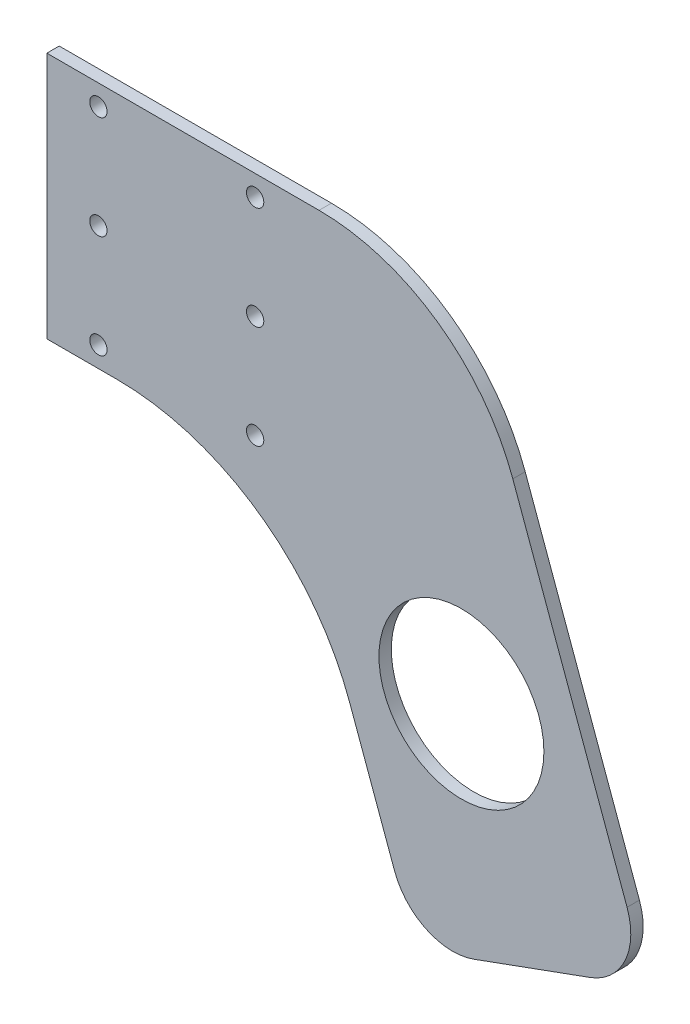
ISO-10303-21;
HEADER;
FILE_DESCRIPTION(('STEP AP214'),'2;1');
FILE_NAME('part.step','',(''),(''),'','','');
FILE_SCHEMA(('AUTOMOTIVE_DESIGN { 1 0 10303 214 1 1 1 1 }'));
ENDSEC;
DATA;
#1=APPLICATION_CONTEXT('core data for automotive mechanical design processes');
#2=APPLICATION_PROTOCOL_DEFINITION('international standard','automotive_design',2000,#1);
#3=PRODUCT_CONTEXT('',#1,'mechanical');
#4=PRODUCT('Part','Part','',(#3));
#5=PRODUCT_RELATED_PRODUCT_CATEGORY('part','',(#4));
#6=PRODUCT_DEFINITION_FORMATION('','',#4);
#7=PRODUCT_DEFINITION_CONTEXT('part definition',#1,'design');
#8=PRODUCT_DEFINITION('design','',#6,#7);
#9=PRODUCT_DEFINITION_SHAPE('','',#8);
#10=(LENGTH_UNIT() NAMED_UNIT(*) SI_UNIT(.MILLI.,.METRE.));
#11=(NAMED_UNIT(*) PLANE_ANGLE_UNIT() SI_UNIT($,.RADIAN.));
#12=(NAMED_UNIT(*) SI_UNIT($,.STERADIAN.) SOLID_ANGLE_UNIT());
#13=UNCERTAINTY_MEASURE_WITH_UNIT(LENGTH_MEASURE(1.E-05),#10,'distance_accuracy_value','');
#14=(GEOMETRIC_REPRESENTATION_CONTEXT(3) GLOBAL_UNCERTAINTY_ASSIGNED_CONTEXT((#13)) GLOBAL_UNIT_ASSIGNED_CONTEXT((#10,
#11,#12)) REPRESENTATION_CONTEXT('',''));
#15=CARTESIAN_POINT('',(0.,0.,0.));
#16=DIRECTION('',(0.,0.,1.));
#17=DIRECTION('',(1.,0.,0.));
#18=AXIS2_PLACEMENT_3D('',#15,#16,#17);
#19=CARTESIAN_POINT('',(0.,0.,3.));
#20=DIRECTION('',(0.,0.,1.));
#21=DIRECTION('',(1.,0.,0.));
#22=AXIS2_PLACEMENT_3D('',#19,#20,#21);
#23=PLANE('',#22);
#24=CARTESIAN_POINT('',(-29.5,56.5646236357601,3.));
#25=DIRECTION('',(0.,0.,1.));
#26=DIRECTION('',(1.,0.,0.));
#27=AXIS2_PLACEMENT_3D('',#24,#25,#26);
#28=CIRCLE('',#27,2.1);
#29=CARTESIAN_POINT('',(-27.4,56.5646236357601,3.));
#30=VERTEX_POINT('',#29);
#31=EDGE_CURVE('E255',#30,#30,#28,.T.);
#32=ORIENTED_EDGE('',*,*,#31,.F.);
#33=EDGE_LOOP('',(#32));
#34=FACE_BOUND('',#33,.T.);
#35=CARTESIAN_POINT('',(-67.5,31.5646236357601,3.));
#36=DIRECTION('',(0.,0.,1.));
#37=DIRECTION('',(1.,0.,0.));
#38=AXIS2_PLACEMENT_3D('',#35,#36,#37);
#39=CIRCLE('',#38,2.1);
#40=CARTESIAN_POINT('',(-65.4,31.5646236357601,3.));
#41=VERTEX_POINT('',#40);
#42=EDGE_CURVE('E243',#41,#41,#39,.T.);
#43=ORIENTED_EDGE('',*,*,#42,.F.);
#44=EDGE_LOOP('',(#43));
#45=FACE_BOUND('',#44,.T.);
#46=CARTESIAN_POINT('',(-67.5,81.5646236357601,3.));
#47=DIRECTION('',(0.,0.,1.));
#48=DIRECTION('',(1.,0.,0.));
#49=AXIS2_PLACEMENT_3D('',#46,#47,#48);
#50=CIRCLE('',#49,2.1);
#51=CARTESIAN_POINT('',(-65.4,81.5646236357601,3.));
#52=VERTEX_POINT('',#51);
#53=EDGE_CURVE('E231',#52,#52,#50,.T.);
#54=ORIENTED_EDGE('',*,*,#53,.F.);
#55=EDGE_LOOP('',(#54));
#56=FACE_BOUND('',#55,.T.);
#57=DIRECTION('',(0.939692620785907,0.342020143325674,0.));
#58=VECTOR('',#57,1.);
#59=CARTESIAN_POINT('',(9.4314371422469,-57.0621689504598,3.));
#60=LINE('',#59,#58);
#61=CARTESIAN_POINT('',(23.5268264540355,-51.9318668005747,3.));
#62=VERTEX_POINT('',#61);
#63=CARTESIAN_POINT('',(51.7176050776127,-41.6712625008045,3.));
#64=VERTEX_POINT('',#63);
#65=EDGE_CURVE('E197',#62,#64,#60,.T.);
#66=ORIENTED_EDGE('',*,*,#65,.T.);
#67=CARTESIAN_POINT('',(46.5873029277276,-27.5758731890159,3.));
#68=DIRECTION('',(0.,0.,1.));
#69=DIRECTION('',(1.,0.,0.));
#70=AXIS2_PLACEMENT_3D('',#67,#68,#69);
#71=CIRCLE('',#70,15.);
#72=CARTESIAN_POINT('',(60.6826922395162,-22.4455710391308,3.));
#73=VERTEX_POINT('',#72);
#74=EDGE_CURVE('E51',#64,#73,#71,.T.);
#75=ORIENTED_EDGE('',*,*,#74,.T.);
#76=DIRECTION('',(-0.342020143325674,0.939692620785907,0.));
#77=VECTOR('',#76,1.);
#78=CARTESIAN_POINT('',(21.0062261462912,86.5646236357601,3.));
#79=LINE('',#78,#77);
#80=CARTESIAN_POINT('',(32.9804802751012,53.6656308020438,3.));
#81=VERTEX_POINT('',#80);
#82=EDGE_CURVE('E133',#73,#81,#79,.T.);
#83=ORIENTED_EDGE('',*,*,#82,.T.);
#84=CARTESIAN_POINT('',(-14.0041507641941,36.5646236357601,3.));
#85=DIRECTION('',(0.,0.,1.));
#86=DIRECTION('',(1.,0.,0.));
#87=AXIS2_PLACEMENT_3D('',#84,#85,#86);
#88=CIRCLE('',#87,50.);
#89=CARTESIAN_POINT('',(-14.0041507641941,86.5646236357601,3.));
#90=VERTEX_POINT('',#89);
#91=EDGE_CURVE('E129',#81,#90,#88,.T.);
#92=ORIENTED_EDGE('',*,*,#91,.T.);
#93=DIRECTION('',(-1.,0.,0.));
#94=VECTOR('',#93,1.);
#95=CARTESIAN_POINT('',(0.,86.5646236357601,3.));
#96=LINE('',#95,#94);
#97=CARTESIAN_POINT('',(-80.,86.5646236357601,3.));
#98=VERTEX_POINT('',#97);
#99=EDGE_CURVE('E121',#90,#98,#96,.T.);
#100=ORIENTED_EDGE('',*,*,#99,.T.);
#101=DIRECTION('',(0.,-1.,0.));
#102=VECTOR('',#101,1.);
#103=CARTESIAN_POINT('',(-80.,26.5646236357601,3.));
#104=LINE('',#103,#102);
#105=CARTESIAN_POINT('',(-80.,26.5646236357601,3.));
#106=VERTEX_POINT('',#105);
#107=EDGE_CURVE('E126',#98,#106,#104,.T.);
#108=ORIENTED_EDGE('',*,*,#107,.T.);
#109=DIRECTION('',(1.,0.,0.));
#110=VECTOR('',#109,1.);
#111=CARTESIAN_POINT('',(-80.,26.5646236357601,3.));
#112=LINE('',#111,#110);
#113=CARTESIAN_POINT('',(-63.0186784388735,26.5646236357601,3.));
#114=VERTEX_POINT('',#113);
#115=EDGE_CURVE('E164',#106,#114,#112,.T.);
#116=ORIENTED_EDGE('',*,*,#115,.T.);
#117=CARTESIAN_POINT('',(-63.0186784388735,-33.4353763642399,3.));
#118=DIRECTION('',(0.,0.,1.));
#119=DIRECTION('',(1.,0.,0.));
#120=AXIS2_PLACEMENT_3D('',#117,#118,#119);
#121=CIRCLE('',#120,60.);
#122=CARTESIAN_POINT('',(-6.63712119171913,-12.9141677646995,3.));
#123=VERTEX_POINT('',#122);
#124=EDGE_CURVE('E181',#114,#123,#121,.F.);
#125=ORIENTED_EDGE('',*,*,#124,.T.);
#126=DIRECTION('',(0.342020143325674,-0.939692620785907,0.));
#127=VECTOR('',#126,1.);
#128=CARTESIAN_POINT('',(-21.0062261462912,26.5646236357601,3.));
#129=LINE('',#128,#127);
#130=CARTESIAN_POINT('',(4.3011349923618,-42.9667796386713,3.));
#131=VERTEX_POINT('',#130);
#132=EDGE_CURVE('E216',#123,#131,#129,.T.);
#133=ORIENTED_EDGE('',*,*,#132,.T.);
#134=CARTESIAN_POINT('',(18.3965243041504,-37.8364774887862,3.));
#135=DIRECTION('',(0.,0.,1.));
#136=DIRECTION('',(1.,0.,0.));
#137=AXIS2_PLACEMENT_3D('',#134,#135,#136);
#138=CIRCLE('',#137,15.);
#139=EDGE_CURVE('E194',#131,#62,#138,.T.);
#140=ORIENTED_EDGE('',*,*,#139,.T.);
#141=EDGE_LOOP('',(#66,#75,#83,#92,#100,#108,#116,#125,#133,#140));
#142=FACE_BOUND('',#141,.T.);
#143=CARTESIAN_POINT('',(20.5212085995404,0.183066388605708,3.));
#144=DIRECTION('',(0.,0.,1.));
#145=DIRECTION('',(1.,0.,0.));
#146=AXIS2_PLACEMENT_3D('',#143,#144,#145);
#147=CIRCLE('',#146,20.);
#148=CARTESIAN_POINT('',(40.5212085995404,0.183066388605708,3.));
#149=VERTEX_POINT('',#148);
#150=EDGE_CURVE('E156',#149,#149,#147,.T.);
#151=ORIENTED_EDGE('',*,*,#150,.F.);
#152=EDGE_LOOP('',(#151));
#153=FACE_BOUND('',#152,.T.);
#154=CARTESIAN_POINT('',(-67.5,56.5646236357601,3.));
#155=DIRECTION('',(0.,0.,1.));
#156=DIRECTION('',(1.,0.,0.));
#157=AXIS2_PLACEMENT_3D('',#154,#155,#156);
#158=CIRCLE('',#157,2.1);
#159=CARTESIAN_POINT('',(-65.4,56.5646236357601,3.));
#160=VERTEX_POINT('',#159);
#161=EDGE_CURVE('E237',#160,#160,#158,.T.);
#162=ORIENTED_EDGE('',*,*,#161,.F.);
#163=EDGE_LOOP('',(#162));
#164=FACE_BOUND('',#163,.T.);
#165=CARTESIAN_POINT('',(-29.5,81.5646236357601,3.));
#166=DIRECTION('',(0.,0.,1.));
#167=DIRECTION('',(1.,0.,0.));
#168=AXIS2_PLACEMENT_3D('',#165,#166,#167);
#169=CIRCLE('',#168,2.1);
#170=CARTESIAN_POINT('',(-27.4,81.5646236357601,3.));
#171=VERTEX_POINT('',#170);
#172=EDGE_CURVE('E249',#171,#171,#169,.T.);
#173=ORIENTED_EDGE('',*,*,#172,.F.);
#174=EDGE_LOOP('',(#173));
#175=FACE_BOUND('',#174,.T.);
#176=CARTESIAN_POINT('',(-29.5,31.5646236357601,3.));
#177=DIRECTION('',(0.,0.,1.));
#178=DIRECTION('',(1.,0.,0.));
#179=AXIS2_PLACEMENT_3D('',#176,#177,#178);
#180=CIRCLE('',#179,2.1);
#181=CARTESIAN_POINT('',(-27.4,31.5646236357601,3.));
#182=VERTEX_POINT('',#181);
#183=EDGE_CURVE('E261',#182,#182,#180,.T.);
#184=ORIENTED_EDGE('',*,*,#183,.F.);
#185=EDGE_LOOP('',(#184));
#186=FACE_BOUND('',#185,.T.);
#187=ADVANCED_FACE('F43',(#34,#45,#56,#142,#153,#164,#175,#186),#23,.T.);
#188=CARTESIAN_POINT('',(0.,0.,0.));
#189=DIRECTION('',(0.,0.,1.));
#190=DIRECTION('',(1.,0.,0.));
#191=AXIS2_PLACEMENT_3D('',#188,#189,#190);
#192=PLANE('',#191);
#193=DIRECTION('',(-0.342020143325674,0.939692620785907,0.));
#194=VECTOR('',#193,1.);
#195=CARTESIAN_POINT('',(21.0062261462912,86.5646236357601,0.));
#196=LINE('',#195,#194);
#197=CARTESIAN_POINT('',(60.6826922395162,-22.4455710391308,0.));
#198=VERTEX_POINT('',#197);
#199=CARTESIAN_POINT('',(32.9804802751012,53.6656308020438,0.));
#200=VERTEX_POINT('',#199);
#201=EDGE_CURVE('E160',#198,#200,#196,.T.);
#202=ORIENTED_EDGE('',*,*,#201,.F.);
#203=CARTESIAN_POINT('',(46.5873029277276,-27.5758731890159,0.));
#204=DIRECTION('',(0.,0.,1.));
#205=DIRECTION('',(1.,0.,0.));
#206=AXIS2_PLACEMENT_3D('',#203,#204,#205);
#207=CIRCLE('',#206,15.);
#208=CARTESIAN_POINT('',(51.7176050776127,-41.6712625008045,0.));
#209=VERTEX_POINT('',#208);
#210=EDGE_CURVE('E188',#198,#209,#207,.F.);
#211=ORIENTED_EDGE('',*,*,#210,.T.);
#212=DIRECTION('',(0.939692620785907,0.342020143325674,0.));
#213=VECTOR('',#212,1.);
#214=CARTESIAN_POINT('',(9.4314371422469,-57.0621689504598,0.));
#215=LINE('',#214,#213);
#216=CARTESIAN_POINT('',(23.5268264540355,-51.9318668005747,0.));
#217=VERTEX_POINT('',#216);
#218=EDGE_CURVE('E158',#217,#209,#215,.T.);
#219=ORIENTED_EDGE('',*,*,#218,.F.);
#220=CARTESIAN_POINT('',(18.3965243041504,-37.8364774887862,0.));
#221=DIRECTION('',(0.,0.,1.));
#222=DIRECTION('',(1.,0.,0.));
#223=AXIS2_PLACEMENT_3D('',#220,#221,#222);
#224=CIRCLE('',#223,15.);
#225=CARTESIAN_POINT('',(4.3011349923618,-42.9667796386713,0.));
#226=VERTEX_POINT('',#225);
#227=EDGE_CURVE('E186',#217,#226,#224,.F.);
#228=ORIENTED_EDGE('',*,*,#227,.T.);
#229=DIRECTION('',(0.342020143325674,-0.939692620785907,0.));
#230=VECTOR('',#229,1.);
#231=CARTESIAN_POINT('',(-21.0062261462912,26.5646236357601,0.));
#232=LINE('',#231,#230);
#233=CARTESIAN_POINT('',(-6.63712119171913,-12.9141677646995,0.));
#234=VERTEX_POINT('',#233);
#235=EDGE_CURVE('E155',#234,#226,#232,.T.);
#236=ORIENTED_EDGE('',*,*,#235,.F.);
#237=CARTESIAN_POINT('',(-63.0186784388735,-33.4353763642399,0.));
#238=DIRECTION('',(0.,0.,1.));
#239=DIRECTION('',(1.,0.,0.));
#240=AXIS2_PLACEMENT_3D('',#237,#238,#239);
#241=CIRCLE('',#240,60.);
#242=CARTESIAN_POINT('',(-63.0186784388735,26.5646236357601,0.));
#243=VERTEX_POINT('',#242);
#244=EDGE_CURVE('E179',#234,#243,#241,.T.);
#245=ORIENTED_EDGE('',*,*,#244,.T.);
#246=DIRECTION('',(1.,0.,0.));
#247=VECTOR('',#246,1.);
#248=CARTESIAN_POINT('',(-80.,26.5646236357601,0.));
#249=LINE('',#248,#247);
#250=CARTESIAN_POINT('',(-80.,26.5646236357601,0.));
#251=VERTEX_POINT('',#250);
#252=EDGE_CURVE('E152',#251,#243,#249,.T.);
#253=ORIENTED_EDGE('',*,*,#252,.F.);
#254=DIRECTION('',(0.,-1.,0.));
#255=VECTOR('',#254,1.);
#256=CARTESIAN_POINT('',(-80.,26.5646236357601,0.));
#257=LINE('',#256,#255);
#258=CARTESIAN_POINT('',(-80.,86.5646236357601,0.));
#259=VERTEX_POINT('',#258);
#260=EDGE_CURVE('E163',#259,#251,#257,.T.);
#261=ORIENTED_EDGE('',*,*,#260,.F.);
#262=DIRECTION('',(-1.,0.,0.));
#263=VECTOR('',#262,1.);
#264=CARTESIAN_POINT('',(-80.,86.5646236357601,0.));
#265=LINE('',#264,#263);
#266=CARTESIAN_POINT('',(-14.0041507641941,86.5646236357601,0.));
#267=VERTEX_POINT('',#266);
#268=EDGE_CURVE('E139',#267,#259,#265,.T.);
#269=ORIENTED_EDGE('',*,*,#268,.F.);
#270=CARTESIAN_POINT('',(-14.0041507641941,36.5646236357601,0.));
#271=DIRECTION('',(0.,0.,1.));
#272=DIRECTION('',(1.,0.,0.));
#273=AXIS2_PLACEMENT_3D('',#270,#271,#272);
#274=CIRCLE('',#273,50.);
#275=EDGE_CURVE('E167',#267,#200,#274,.F.);
#276=ORIENTED_EDGE('',*,*,#275,.T.);
#277=EDGE_LOOP('',(#202,#211,#219,#228,#236,#245,#253,#261,#269,#276));
#278=FACE_BOUND('',#277,.T.);
#279=CARTESIAN_POINT('',(20.5212085995404,0.183066388605708,0.));
#280=DIRECTION('',(0.,0.,1.));
#281=DIRECTION('',(1.,0.,0.));
#282=AXIS2_PLACEMENT_3D('',#279,#280,#281);
#283=CIRCLE('',#282,20.);
#284=CARTESIAN_POINT('',(40.5212085995404,0.183066388605708,0.));
#285=VERTEX_POINT('',#284);
#286=EDGE_CURVE('E227',#285,#285,#283,.T.);
#287=ORIENTED_EDGE('',*,*,#286,.T.);
#288=EDGE_LOOP('',(#287));
#289=FACE_BOUND('',#288,.T.);
#290=CARTESIAN_POINT('',(-67.5,81.5646236357601,0.));
#291=DIRECTION('',(0.,0.,1.));
#292=DIRECTION('',(1.,0.,0.));
#293=AXIS2_PLACEMENT_3D('',#290,#291,#292);
#294=CIRCLE('',#293,2.1);
#295=CARTESIAN_POINT('',(-65.4,81.5646236357601,0.));
#296=VERTEX_POINT('',#295);
#297=EDGE_CURVE('E234',#296,#296,#294,.T.);
#298=ORIENTED_EDGE('',*,*,#297,.T.);
#299=EDGE_LOOP('',(#298));
#300=FACE_BOUND('',#299,.T.);
#301=CARTESIAN_POINT('',(-67.5,56.5646236357601,0.));
#302=DIRECTION('',(0.,0.,1.));
#303=DIRECTION('',(1.,0.,0.));
#304=AXIS2_PLACEMENT_3D('',#301,#302,#303);
#305=CIRCLE('',#304,2.1);
#306=CARTESIAN_POINT('',(-65.4,56.5646236357601,0.));
#307=VERTEX_POINT('',#306);
#308=EDGE_CURVE('E240',#307,#307,#305,.T.);
#309=ORIENTED_EDGE('',*,*,#308,.T.);
#310=EDGE_LOOP('',(#309));
#311=FACE_BOUND('',#310,.T.);
#312=CARTESIAN_POINT('',(-67.5,31.5646236357601,0.));
#313=DIRECTION('',(0.,0.,1.));
#314=DIRECTION('',(1.,0.,0.));
#315=AXIS2_PLACEMENT_3D('',#312,#313,#314);
#316=CIRCLE('',#315,2.1);
#317=CARTESIAN_POINT('',(-65.4,31.5646236357601,0.));
#318=VERTEX_POINT('',#317);
#319=EDGE_CURVE('E246',#318,#318,#316,.T.);
#320=ORIENTED_EDGE('',*,*,#319,.T.);
#321=EDGE_LOOP('',(#320));
#322=FACE_BOUND('',#321,.T.);
#323=CARTESIAN_POINT('',(-29.5,81.5646236357601,0.));
#324=DIRECTION('',(0.,0.,1.));
#325=DIRECTION('',(1.,0.,0.));
#326=AXIS2_PLACEMENT_3D('',#323,#324,#325);
#327=CIRCLE('',#326,2.1);
#328=CARTESIAN_POINT('',(-27.4,81.5646236357601,0.));
#329=VERTEX_POINT('',#328);
#330=EDGE_CURVE('E252',#329,#329,#327,.T.);
#331=ORIENTED_EDGE('',*,*,#330,.T.);
#332=EDGE_LOOP('',(#331));
#333=FACE_BOUND('',#332,.T.);
#334=CARTESIAN_POINT('',(-29.5,56.5646236357601,0.));
#335=DIRECTION('',(0.,0.,1.));
#336=DIRECTION('',(1.,0.,0.));
#337=AXIS2_PLACEMENT_3D('',#334,#335,#336);
#338=CIRCLE('',#337,2.1);
#339=CARTESIAN_POINT('',(-27.4,56.5646236357601,0.));
#340=VERTEX_POINT('',#339);
#341=EDGE_CURVE('E258',#340,#340,#338,.T.);
#342=ORIENTED_EDGE('',*,*,#341,.T.);
#343=EDGE_LOOP('',(#342));
#344=FACE_BOUND('',#343,.T.);
#345=CARTESIAN_POINT('',(-29.5,31.5646236357601,0.));
#346=DIRECTION('',(0.,0.,1.));
#347=DIRECTION('',(1.,0.,0.));
#348=AXIS2_PLACEMENT_3D('',#345,#346,#347);
#349=CIRCLE('',#348,2.1);
#350=CARTESIAN_POINT('',(-27.4,31.5646236357601,0.));
#351=VERTEX_POINT('',#350);
#352=EDGE_CURVE('E264',#351,#351,#349,.T.);
#353=ORIENTED_EDGE('',*,*,#352,.T.);
#354=EDGE_LOOP('',(#353));
#355=FACE_BOUND('',#354,.T.);
#356=ADVANCED_FACE('F207',(#278,#289,#300,#311,#322,#333,#344,#355),#192,.F.);
#357=CARTESIAN_POINT('',(-80.,26.5646236357601,3.));
#358=DIRECTION('',(0.,1.,0.));
#359=DIRECTION('',(-1.,0.,0.));
#360=AXIS2_PLACEMENT_3D('',#357,#358,#359);
#361=PLANE('',#360);
#362=ORIENTED_EDGE('',*,*,#252,.T.);
#363=DIRECTION('',(0.,0.,-1.));
#364=VECTOR('',#363,1.);
#365=CARTESIAN_POINT('',(-63.0186784388735,26.5646236357601,3.));
#366=LINE('',#365,#364);
#367=EDGE_CURVE('E177',#243,#114,#366,.F.);
#368=ORIENTED_EDGE('',*,*,#367,.T.);
#369=ORIENTED_EDGE('',*,*,#115,.F.);
#370=DIRECTION('',(0.,0.,-1.));
#371=VECTOR('',#370,1.);
#372=CARTESIAN_POINT('',(-80.,26.5646236357601,3.));
#373=LINE('',#372,#371);
#374=EDGE_CURVE('E143',#106,#251,#373,.T.);
#375=ORIENTED_EDGE('',*,*,#374,.T.);
#376=EDGE_LOOP('',(#362,#368,#369,#375));
#377=FACE_BOUND('',#376,.T.);
#378=ADVANCED_FACE('F223',(#377),#361,.F.);
#379=CARTESIAN_POINT('',(-21.0062261462912,26.5646236357601,3.));
#380=DIRECTION('',(0.939692620785906,0.342020143325673,0.));
#381=DIRECTION('',(-0.342020143325674,0.939692620785907,0.));
#382=AXIS2_PLACEMENT_3D('',#379,#380,#381);
#383=PLANE('',#382);
#384=ORIENTED_EDGE('',*,*,#235,.T.);
#385=DIRECTION('',(0.,0.,-1.));
#386=VECTOR('',#385,1.);
#387=CARTESIAN_POINT('',(4.3011349923618,-42.9667796386713,3.));
#388=LINE('',#387,#386);
#389=EDGE_CURVE('E11',#226,#131,#388,.F.);
#390=ORIENTED_EDGE('',*,*,#389,.T.);
#391=ORIENTED_EDGE('',*,*,#132,.F.);
#392=DIRECTION('',(0.,0.,-1.));
#393=VECTOR('',#392,1.);
#394=CARTESIAN_POINT('',(-6.63712119171913,-12.9141677646995,0.));
#395=LINE('',#394,#393);
#396=EDGE_CURVE('E174',#123,#234,#395,.T.);
#397=ORIENTED_EDGE('',*,*,#396,.T.);
#398=EDGE_LOOP('',(#384,#390,#391,#397));
#399=FACE_BOUND('',#398,.T.);
#400=ADVANCED_FACE('F214',(#399),#383,.F.);
#401=CARTESIAN_POINT('',(9.4314371422469,-57.0621689504598,3.));
#402=DIRECTION('',(-0.342020143325673,0.939692620785906,0.));
#403=DIRECTION('',(-0.939692620785907,-0.342020143325674,0.));
#404=AXIS2_PLACEMENT_3D('',#401,#402,#403);
#405=PLANE('',#404);
#406=ORIENTED_EDGE('',*,*,#218,.T.);
#407=DIRECTION('',(0.,0.,-1.));
#408=VECTOR('',#407,1.);
#409=CARTESIAN_POINT('',(51.7176050776127,-41.6712625008045,3.));
#410=LINE('',#409,#408);
#411=EDGE_CURVE('E64',#209,#64,#410,.F.);
#412=ORIENTED_EDGE('',*,*,#411,.T.);
#413=ORIENTED_EDGE('',*,*,#65,.F.);
#414=DIRECTION('',(0.,0.,-1.));
#415=VECTOR('',#414,1.);
#416=CARTESIAN_POINT('',(23.5268264540355,-51.9318668005747,3.));
#417=LINE('',#416,#415);
#418=EDGE_CURVE('E190',#62,#217,#417,.T.);
#419=ORIENTED_EDGE('',*,*,#418,.T.);
#420=EDGE_LOOP('',(#406,#412,#413,#419));
#421=FACE_BOUND('',#420,.T.);
#422=ADVANCED_FACE('F209',(#421),#405,.F.);
#423=CARTESIAN_POINT('',(21.0062261462912,86.5646236357601,3.));
#424=DIRECTION('',(-0.939692620785906,-0.342020143325673,0.));
#425=DIRECTION('',(0.342020143325674,-0.939692620785907,0.));
#426=AXIS2_PLACEMENT_3D('',#423,#424,#425);
#427=PLANE('',#426);
#428=ORIENTED_EDGE('',*,*,#82,.F.);
#429=DIRECTION('',(0.,0.,-1.));
#430=VECTOR('',#429,1.);
#431=CARTESIAN_POINT('',(60.6826922395162,-22.4455710391308,3.));
#432=LINE('',#431,#430);
#433=EDGE_CURVE('E183',#73,#198,#432,.T.);
#434=ORIENTED_EDGE('',*,*,#433,.T.);
#435=ORIENTED_EDGE('',*,*,#201,.T.);
#436=DIRECTION('',(0.,0.,-1.));
#437=VECTOR('',#436,1.);
#438=CARTESIAN_POINT('',(32.9804802751012,53.6656308020438,3.));
#439=LINE('',#438,#437);
#440=EDGE_CURVE('E170',#200,#81,#439,.F.);
#441=ORIENTED_EDGE('',*,*,#440,.T.);
#442=EDGE_LOOP('',(#428,#434,#435,#441));
#443=FACE_BOUND('',#442,.T.);
#444=ADVANCED_FACE('F201',(#443),#427,.F.);
#445=CARTESIAN_POINT('',(-80.,86.5646236357601,3.));
#446=DIRECTION('',(0.,-1.,0.));
#447=DIRECTION('',(0.,0.,-1.));
#448=AXIS2_PLACEMENT_3D('',#445,#446,#447);
#449=PLANE('',#448);
#450=ORIENTED_EDGE('',*,*,#99,.F.);
#451=DIRECTION('',(0.,0.,-1.));
#452=VECTOR('',#451,1.);
#453=CARTESIAN_POINT('',(-14.0041507641941,86.5646236357601,3.));
#454=LINE('',#453,#452);
#455=EDGE_CURVE('E142',#90,#267,#454,.T.);
#456=ORIENTED_EDGE('',*,*,#455,.T.);
#457=ORIENTED_EDGE('',*,*,#268,.T.);
#458=DIRECTION('',(0.,0.,-1.));
#459=VECTOR('',#458,1.);
#460=CARTESIAN_POINT('',(-80.,86.5646236357601,3.));
#461=LINE('',#460,#459);
#462=EDGE_CURVE('E136',#98,#259,#461,.T.);
#463=ORIENTED_EDGE('',*,*,#462,.F.);
#464=EDGE_LOOP('',(#450,#456,#457,#463));
#465=FACE_BOUND('',#464,.T.);
#466=ADVANCED_FACE('F137',(#465),#449,.F.);
#467=CARTESIAN_POINT('',(-80.,26.5646236357601,3.));
#468=DIRECTION('',(1.,0.,0.));
#469=DIRECTION('',(0.,1.,0.));
#470=AXIS2_PLACEMENT_3D('',#467,#468,#469);
#471=PLANE('',#470);
#472=ORIENTED_EDGE('',*,*,#260,.T.);
#473=ORIENTED_EDGE('',*,*,#374,.F.);
#474=ORIENTED_EDGE('',*,*,#107,.F.);
#475=ORIENTED_EDGE('',*,*,#462,.T.);
#476=EDGE_LOOP('',(#472,#473,#474,#475));
#477=FACE_BOUND('',#476,.T.);
#478=ADVANCED_FACE('F145',(#477),#471,.F.);
#479=CARTESIAN_POINT('',(20.5212085995404,0.183066388605708,3.));
#480=DIRECTION('',(0.,0.,-1.));
#481=DIRECTION('',(-1.,0.,0.));
#482=AXIS2_PLACEMENT_3D('',#479,#480,#481);
#483=CYLINDRICAL_SURFACE('',#482,20.);
#484=ORIENTED_EDGE('',*,*,#150,.T.);
#485=EDGE_LOOP('',(#484));
#486=FACE_BOUND('',#485,.T.);
#487=ORIENTED_EDGE('',*,*,#286,.F.);
#488=EDGE_LOOP('',(#487));
#489=FACE_BOUND('',#488,.T.);
#490=ADVANCED_FACE('F284',(#486,#489),#483,.F.);
#491=CARTESIAN_POINT('',(-67.5,81.5646236357601,3.));
#492=DIRECTION('',(0.,0.,-1.));
#493=DIRECTION('',(-1.,0.,0.));
#494=AXIS2_PLACEMENT_3D('',#491,#492,#493);
#495=CYLINDRICAL_SURFACE('',#494,2.1);
#496=ORIENTED_EDGE('',*,*,#53,.T.);
#497=EDGE_LOOP('',(#496));
#498=FACE_BOUND('',#497,.T.);
#499=ORIENTED_EDGE('',*,*,#297,.F.);
#500=EDGE_LOOP('',(#499));
#501=FACE_BOUND('',#500,.T.);
#502=ADVANCED_FACE('F374',(#498,#501),#495,.F.);
#503=CARTESIAN_POINT('',(-67.5,56.5646236357601,3.));
#504=DIRECTION('',(0.,0.,-1.));
#505=DIRECTION('',(-1.,0.,0.));
#506=AXIS2_PLACEMENT_3D('',#503,#504,#505);
#507=CYLINDRICAL_SURFACE('',#506,2.1);
#508=ORIENTED_EDGE('',*,*,#161,.T.);
#509=EDGE_LOOP('',(#508));
#510=FACE_BOUND('',#509,.T.);
#511=ORIENTED_EDGE('',*,*,#308,.F.);
#512=EDGE_LOOP('',(#511));
#513=FACE_BOUND('',#512,.T.);
#514=ADVANCED_FACE('F364',(#510,#513),#507,.F.);
#515=CARTESIAN_POINT('',(-67.5,31.5646236357601,3.));
#516=DIRECTION('',(0.,0.,-1.));
#517=DIRECTION('',(-1.,0.,0.));
#518=AXIS2_PLACEMENT_3D('',#515,#516,#517);
#519=CYLINDRICAL_SURFACE('',#518,2.1);
#520=ORIENTED_EDGE('',*,*,#42,.T.);
#521=EDGE_LOOP('',(#520));
#522=FACE_BOUND('',#521,.T.);
#523=ORIENTED_EDGE('',*,*,#319,.F.);
#524=EDGE_LOOP('',(#523));
#525=FACE_BOUND('',#524,.T.);
#526=ADVANCED_FACE('F354',(#522,#525),#519,.F.);
#527=CARTESIAN_POINT('',(-29.5,81.5646236357601,3.));
#528=DIRECTION('',(0.,0.,-1.));
#529=DIRECTION('',(-1.,0.,0.));
#530=AXIS2_PLACEMENT_3D('',#527,#528,#529);
#531=CYLINDRICAL_SURFACE('',#530,2.1);
#532=ORIENTED_EDGE('',*,*,#172,.T.);
#533=EDGE_LOOP('',(#532));
#534=FACE_BOUND('',#533,.T.);
#535=ORIENTED_EDGE('',*,*,#330,.F.);
#536=EDGE_LOOP('',(#535));
#537=FACE_BOUND('',#536,.T.);
#538=ADVANCED_FACE('F344',(#534,#537),#531,.F.);
#539=CARTESIAN_POINT('',(-29.5,56.5646236357601,3.));
#540=DIRECTION('',(0.,0.,-1.));
#541=DIRECTION('',(-1.,0.,0.));
#542=AXIS2_PLACEMENT_3D('',#539,#540,#541);
#543=CYLINDRICAL_SURFACE('',#542,2.1);
#544=ORIENTED_EDGE('',*,*,#31,.T.);
#545=EDGE_LOOP('',(#544));
#546=FACE_BOUND('',#545,.T.);
#547=ORIENTED_EDGE('',*,*,#341,.F.);
#548=EDGE_LOOP('',(#547));
#549=FACE_BOUND('',#548,.T.);
#550=ADVANCED_FACE('F335',(#546,#549),#543,.F.);
#551=CARTESIAN_POINT('',(-29.5,31.5646236357601,3.));
#552=DIRECTION('',(0.,0.,-1.));
#553=DIRECTION('',(-1.,0.,0.));
#554=AXIS2_PLACEMENT_3D('',#551,#552,#553);
#555=CYLINDRICAL_SURFACE('',#554,2.1);
#556=ORIENTED_EDGE('',*,*,#183,.T.);
#557=EDGE_LOOP('',(#556));
#558=FACE_BOUND('',#557,.T.);
#559=ORIENTED_EDGE('',*,*,#352,.F.);
#560=EDGE_LOOP('',(#559));
#561=FACE_BOUND('',#560,.T.);
#562=ADVANCED_FACE('F270',(#558,#561),#555,.F.);
#563=CARTESIAN_POINT('',(-14.0041507641941,36.5646236357601,3.));
#564=DIRECTION('',(0.,0.,-1.));
#565=DIRECTION('',(-1.,0.,0.));
#566=AXIS2_PLACEMENT_3D('',#563,#564,#565);
#567=CYLINDRICAL_SURFACE('',#566,50.);
#568=ORIENTED_EDGE('',*,*,#91,.F.);
#569=ORIENTED_EDGE('',*,*,#440,.F.);
#570=ORIENTED_EDGE('',*,*,#275,.F.);
#571=ORIENTED_EDGE('',*,*,#455,.F.);
#572=EDGE_LOOP('',(#568,#569,#570,#571));
#573=FACE_BOUND('',#572,.T.);
#574=ADVANCED_FACE('F299',(#573),#567,.T.);
#575=CARTESIAN_POINT('',(-63.0186784388735,-33.4353763642399,3.));
#576=DIRECTION('',(0.,0.,1.));
#577=DIRECTION('',(1.,0.,0.));
#578=AXIS2_PLACEMENT_3D('',#575,#576,#577);
#579=CYLINDRICAL_SURFACE('',#578,60.);
#580=ORIENTED_EDGE('',*,*,#124,.F.);
#581=ORIENTED_EDGE('',*,*,#367,.F.);
#582=ORIENTED_EDGE('',*,*,#244,.F.);
#583=ORIENTED_EDGE('',*,*,#396,.F.);
#584=EDGE_LOOP('',(#580,#581,#582,#583));
#585=FACE_BOUND('',#584,.T.);
#586=ADVANCED_FACE('F219',(#585),#579,.F.);
#587=CARTESIAN_POINT('',(46.5873029277276,-27.5758731890159,3.));
#588=DIRECTION('',(0.,0.,-1.));
#589=DIRECTION('',(-1.,0.,0.));
#590=AXIS2_PLACEMENT_3D('',#587,#588,#589);
#591=CYLINDRICAL_SURFACE('',#590,15.);
#592=ORIENTED_EDGE('',*,*,#74,.F.);
#593=ORIENTED_EDGE('',*,*,#411,.F.);
#594=ORIENTED_EDGE('',*,*,#210,.F.);
#595=ORIENTED_EDGE('',*,*,#433,.F.);
#596=EDGE_LOOP('',(#592,#593,#594,#595));
#597=FACE_BOUND('',#596,.T.);
#598=ADVANCED_FACE('F204',(#597),#591,.T.);
#599=CARTESIAN_POINT('',(18.3965243041504,-37.8364774887862,3.));
#600=DIRECTION('',(0.,0.,-1.));
#601=DIRECTION('',(-1.,0.,0.));
#602=AXIS2_PLACEMENT_3D('',#599,#600,#601);
#603=CYLINDRICAL_SURFACE('',#602,15.);
#604=ORIENTED_EDGE('',*,*,#139,.F.);
#605=ORIENTED_EDGE('',*,*,#389,.F.);
#606=ORIENTED_EDGE('',*,*,#227,.F.);
#607=ORIENTED_EDGE('',*,*,#418,.F.);
#608=EDGE_LOOP('',(#604,#605,#606,#607));
#609=FACE_BOUND('',#608,.T.);
#610=ADVANCED_FACE('F45',(#609),#603,.T.);
#611=CLOSED_SHELL('',(#187,#356,#378,#400,#422,#444,#466,#478,#490,#502,#514,#526,#538,#550,
#562,#574,#586,#598,#610));
#612=MANIFOLD_SOLID_BREP('B2',#611);
#613=ADVANCED_BREP_SHAPE_REPRESENTATION('',(#18,#612),#14);
#614=SHAPE_DEFINITION_REPRESENTATION(#9,#613);
ENDSEC;
END-ISO-10303-21;
